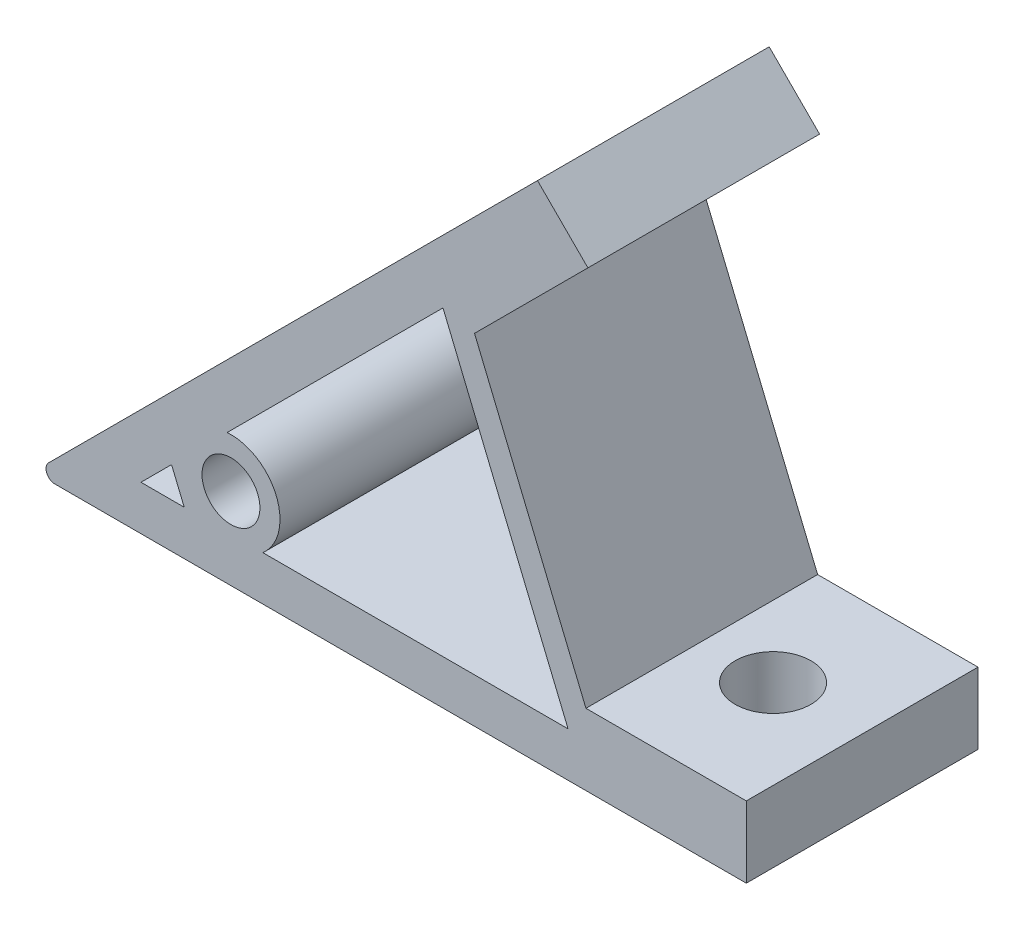
ISO-10303-21;
HEADER;
FILE_DESCRIPTION(('STEP AP214'),'2;1');
FILE_NAME('part.step','',(''),(''),'','','');
FILE_SCHEMA(('AUTOMOTIVE_DESIGN { 1 0 10303 214 1 1 1 1 }'));
ENDSEC;
DATA;
#1=APPLICATION_CONTEXT('core data for automotive mechanical design processes');
#2=APPLICATION_PROTOCOL_DEFINITION('international standard','automotive_design',2000,#1);
#3=PRODUCT_CONTEXT('',#1,'mechanical');
#4=PRODUCT('Part','Part','',(#3));
#5=PRODUCT_RELATED_PRODUCT_CATEGORY('part','',(#4));
#6=PRODUCT_DEFINITION_FORMATION('','',#4);
#7=PRODUCT_DEFINITION_CONTEXT('part definition',#1,'design');
#8=PRODUCT_DEFINITION('design','',#6,#7);
#9=PRODUCT_DEFINITION_SHAPE('','',#8);
#10=(LENGTH_UNIT() NAMED_UNIT(*) SI_UNIT(.MILLI.,.METRE.));
#11=(NAMED_UNIT(*) PLANE_ANGLE_UNIT() SI_UNIT($,.RADIAN.));
#12=(NAMED_UNIT(*) SI_UNIT($,.STERADIAN.) SOLID_ANGLE_UNIT());
#13=UNCERTAINTY_MEASURE_WITH_UNIT(LENGTH_MEASURE(1.E-05),#10,'distance_accuracy_value','');
#14=(GEOMETRIC_REPRESENTATION_CONTEXT(3) GLOBAL_UNCERTAINTY_ASSIGNED_CONTEXT((#13)) GLOBAL_UNIT_ASSIGNED_CONTEXT((#10,
#11,#12)) REPRESENTATION_CONTEXT('',''));
#15=CARTESIAN_POINT('',(0.,0.,0.));
#16=DIRECTION('',(0.,0.,1.));
#17=DIRECTION('',(1.,0.,0.));
#18=AXIS2_PLACEMENT_3D('',#15,#16,#17);
#19=CARTESIAN_POINT('',(-30.4993179415646,38.1869735594505,13.));
#20=DIRECTION('',(-0.707106781186548,0.707106781186547,0.));
#21=DIRECTION('',(-0.707106781186547,-0.707106781186548,0.));
#22=AXIS2_PLACEMENT_3D('',#19,#20,#21);
#23=PLANE('',#22);
#24=DIRECTION('',(0.707106781186547,0.707106781186548,0.));
#25=VECTOR('',#24,1.);
#26=CARTESIAN_POINT('',(-30.4993179415646,38.1869735594505,-13.));
#27=LINE('',#26,#25);
#28=CARTESIAN_POINT('',(-30.4993179415646,38.1869735594505,-13.));
#29=VERTEX_POINT('',#28);
#30=CARTESIAN_POINT('',(-17.7746032555838,50.9116882454314,-13.));
#31=VERTEX_POINT('',#30);
#32=EDGE_CURVE('E236',#29,#31,#27,.T.);
#33=ORIENTED_EDGE('',*,*,#32,.T.);
#34=DIRECTION('',(0.,0.,-1.));
#35=VECTOR('',#34,1.);
#36=CARTESIAN_POINT('',(-17.7746032555838,50.9116882454314,13.));
#37=LINE('',#36,#35);
#38=CARTESIAN_POINT('',(-17.7746032555838,50.9116882454314,13.));
#39=VERTEX_POINT('',#38);
#40=EDGE_CURVE('E246',#39,#31,#37,.T.);
#41=ORIENTED_EDGE('',*,*,#40,.F.);
#42=DIRECTION('',(0.707106781186547,0.707106781186548,0.));
#43=VECTOR('',#42,1.);
#44=CARTESIAN_POINT('',(-30.4993179415646,38.1869735594505,13.));
#45=LINE('',#44,#43);
#46=CARTESIAN_POINT('',(-30.4993179415646,38.1869735594505,13.));
#47=VERTEX_POINT('',#46);
#48=EDGE_CURVE('E219',#47,#39,#45,.T.);
#49=ORIENTED_EDGE('',*,*,#48,.F.);
#50=DIRECTION('',(0.,0.,-1.));
#51=VECTOR('',#50,1.);
#52=CARTESIAN_POINT('',(-30.4993179415646,38.1869735594505,13.));
#53=LINE('',#52,#51);
#54=EDGE_CURVE('E249',#47,#29,#53,.T.);
#55=ORIENTED_EDGE('',*,*,#54,.T.);
#56=EDGE_LOOP('',(#33,#41,#49,#55));
#57=FACE_BOUND('',#56,.T.);
#58=CARTESIAN_POINT('',(-24.8456710674492,43.8406204335659,0.));
#59=DIRECTION('',(-0.70710678118655,0.707106781186545,0.));
#60=DIRECTION('',(-0.707106781186546,-0.707106781186549,0.));
#61=AXIS2_PLACEMENT_3D('',#58,#59,#60);
#62=CIRCLE('',#61,4.25);
#63=CARTESIAN_POINT('',(-27.850874887492,40.8354166135231,0.));
#64=VERTEX_POINT('',#63);
#65=EDGE_CURVE('E305',#64,#64,#62,.T.);
#66=ORIENTED_EDGE('',*,*,#65,.T.);
#67=EDGE_LOOP('',(#66));
#68=FACE_BOUND('',#67,.T.);
#69=ADVANCED_FACE('F35',(#57,#68),#23,.F.);
#70=CARTESIAN_POINT('',(-78.2928932188134,1.7071067811866,13.));
#71=DIRECTION('',(0.707106781186548,-0.707106781186547,0.));
#72=DIRECTION('',(0.707106781186547,0.707106781186548,0.));
#73=AXIS2_PLACEMENT_3D('',#70,#71,#72);
#74=PLANE('',#73);
#75=DIRECTION('',(-0.707106781186547,-0.707106781186548,0.));
#76=VECTOR('',#75,1.);
#77=CARTESIAN_POINT('',(-78.2928932188134,1.7071067811866,-13.));
#78=LINE('',#77,#76);
#79=CARTESIAN_POINT('',(-23.4314575050762,56.5685424949238,-13.));
#80=VERTEX_POINT('',#79);
#81=CARTESIAN_POINT('',(-78.2928932188134,1.7071067811866,-13.));
#82=VERTEX_POINT('',#81);
#83=EDGE_CURVE('E211',#80,#82,#78,.T.);
#84=ORIENTED_EDGE('',*,*,#83,.T.);
#85=DIRECTION('',(0.,0.,-1.));
#86=VECTOR('',#85,1.);
#87=CARTESIAN_POINT('',(-78.2928932188134,1.7071067811866,13.));
#88=LINE('',#87,#86);
#89=CARTESIAN_POINT('',(-78.2928932188134,1.7071067811866,13.));
#90=VERTEX_POINT('',#89);
#91=EDGE_CURVE('E225',#90,#82,#88,.T.);
#92=ORIENTED_EDGE('',*,*,#91,.F.);
#93=DIRECTION('',(-0.707106781186547,-0.707106781186548,0.));
#94=VECTOR('',#93,1.);
#95=CARTESIAN_POINT('',(-78.2928932188134,1.7071067811866,13.));
#96=LINE('',#95,#94);
#97=CARTESIAN_POINT('',(-23.4314575050762,56.5685424949238,13.));
#98=VERTEX_POINT('',#97);
#99=EDGE_CURVE('E223',#98,#90,#96,.T.);
#100=ORIENTED_EDGE('',*,*,#99,.F.);
#101=DIRECTION('',(0.,0.,-1.));
#102=VECTOR('',#101,1.);
#103=CARTESIAN_POINT('',(-23.4314575050762,56.5685424949238,13.));
#104=LINE('',#103,#102);
#105=EDGE_CURVE('E243',#98,#80,#104,.T.);
#106=ORIENTED_EDGE('',*,*,#105,.T.);
#107=EDGE_LOOP('',(#84,#92,#100,#106));
#108=FACE_BOUND('',#107,.T.);
#109=CARTESIAN_POINT('',(-30.5025253169417,49.4974746830583,0.));
#110=DIRECTION('',(0.707106781186548,-0.707106781186547,0.));
#111=DIRECTION('',(0.707106781186547,0.707106781186548,0.));
#112=AXIS2_PLACEMENT_3D('',#109,#110,#111);
#113=CIRCLE('',#112,4.25);
#114=CARTESIAN_POINT('',(-27.4973214968988,52.5026785031012,0.));
#115=VERTEX_POINT('',#114);
#116=EDGE_CURVE('E39',#115,#115,#113,.F.);
#117=ORIENTED_EDGE('',*,*,#116,.F.);
#118=EDGE_LOOP('',(#117));
#119=FACE_BOUND('',#118,.T.);
#120=ADVANCED_FACE('F292',(#108,#119),#74,.F.);
#121=CARTESIAN_POINT('',(-77.5857864376269,1.,13.));
#122=DIRECTION('',(0.,0.,1.));
#123=DIRECTION('',(1.,0.,0.));
#124=AXIS2_PLACEMENT_3D('',#121,#122,#123);
#125=PLANE('',#124);
#126=DIRECTION('',(1.,0.,0.));
#127=VECTOR('',#126,1.);
#128=CARTESIAN_POINT('',(-54.2574687525298,5.,13.));
#129=LINE('',#128,#127);
#130=CARTESIAN_POINT('',(-54.2574687525298,5.,13.));
#131=VERTEX_POINT('',#130);
#132=CARTESIAN_POINT('',(-20.,5.,13.));
#133=VERTEX_POINT('',#132);
#134=EDGE_CURVE('E151',#131,#133,#129,.T.);
#135=ORIENTED_EDGE('',*,*,#134,.F.);
#136=CARTESIAN_POINT('',(-57.8268912197291,9.18440237676214,13.));
#137=DIRECTION('',(0.,0.,-1.));
#138=DIRECTION('',(1.,0.,0.));
#139=AXIS2_PLACEMENT_3D('',#136,#137,#138);
#140=CIRCLE('',#139,5.49999999999996);
#141=CARTESIAN_POINT('',(-58.2617476840749,14.6671845040599,13.));
#142=VERTEX_POINT('',#141);
#143=EDGE_CURVE('E143',#142,#131,#140,.T.);
#144=ORIENTED_EDGE('',*,*,#143,.F.);
#145=DIRECTION('',(-0.707106781186549,-0.707106781186546,0.));
#146=VECTOR('',#145,1.);
#147=CARTESIAN_POINT('',(-58.2617476840749,14.6671845040599,13.));
#148=LINE('',#147,#146);
#149=CARTESIAN_POINT('',(-34.0380592228744,38.8908729652603,13.));
#150=VERTEX_POINT('',#149);
#151=EDGE_CURVE('E167',#150,#142,#148,.T.);
#152=ORIENTED_EDGE('',*,*,#151,.F.);
#153=DIRECTION('',(-0.382683432365087,0.923879532511288,0.));
#154=VECTOR('',#153,1.);
#155=CARTESIAN_POINT('',(-20.,5.,13.));
#156=LINE('',#155,#154);
#157=EDGE_CURVE('E165',#133,#150,#156,.T.);
#158=ORIENTED_EDGE('',*,*,#157,.F.);
#159=EDGE_LOOP('',(#135,#144,#152,#158));
#160=FACE_BOUND('',#159,.T.);
#161=CARTESIAN_POINT('',(-77.5857864376269,1.,13.));
#162=DIRECTION('',(0.,0.,1.));
#163=DIRECTION('',(1.,0.,0.));
#164=AXIS2_PLACEMENT_3D('',#161,#162,#163);
#165=CIRCLE('',#164,1.);
#166=CARTESIAN_POINT('',(-77.5857864376269,0.,13.));
#167=VERTEX_POINT('',#166);
#168=EDGE_CURVE('E207',#90,#167,#165,.T.);
#169=ORIENTED_EDGE('',*,*,#168,.T.);
#170=DIRECTION('',(1.,0.,0.));
#171=VECTOR('',#170,1.);
#172=CARTESIAN_POINT('',(-77.5857864376269,0.,13.));
#173=LINE('',#172,#171);
#174=CARTESIAN_POINT('',(0.,0.,13.));
#175=VERTEX_POINT('',#174);
#176=EDGE_CURVE('E210',#167,#175,#173,.T.);
#177=ORIENTED_EDGE('',*,*,#176,.T.);
#178=DIRECTION('',(0.,1.,0.));
#179=VECTOR('',#178,1.);
#180=CARTESIAN_POINT('',(0.,0.,13.));
#181=LINE('',#180,#179);
#182=CARTESIAN_POINT('',(0.,8.,13.));
#183=VERTEX_POINT('',#182);
#184=EDGE_CURVE('E213',#175,#183,#181,.T.);
#185=ORIENTED_EDGE('',*,*,#184,.T.);
#186=DIRECTION('',(-1.,0.,0.));
#187=VECTOR('',#186,1.);
#188=CARTESIAN_POINT('',(-17.995464086242,8.00000000000012,13.));
#189=LINE('',#188,#187);
#190=CARTESIAN_POINT('',(-17.995464086242,8.00000000000012,13.));
#191=VERTEX_POINT('',#190);
#192=EDGE_CURVE('E215',#183,#191,#189,.T.);
#193=ORIENTED_EDGE('',*,*,#192,.T.);
#194=DIRECTION('',(-0.382683432365096,0.923879532511284,0.));
#195=VECTOR('',#194,1.);
#196=CARTESIAN_POINT('',(-17.995464086242,8.00000000000012,13.));
#197=LINE('',#196,#195);
#198=EDGE_CURVE('E217',#191,#47,#197,.T.);
#199=ORIENTED_EDGE('',*,*,#198,.T.);
#200=ORIENTED_EDGE('',*,*,#48,.T.);
#201=DIRECTION('',(-0.707106781186548,0.707106781186547,0.));
#202=VECTOR('',#201,1.);
#203=CARTESIAN_POINT('',(-17.7746032555838,50.9116882454314,13.));
#204=LINE('',#203,#202);
#205=EDGE_CURVE('E221',#39,#98,#204,.T.);
#206=ORIENTED_EDGE('',*,*,#205,.T.);
#207=ORIENTED_EDGE('',*,*,#99,.T.);
#208=EDGE_LOOP('',(#169,#177,#185,#193,#199,#200,#206,#207));
#209=FACE_BOUND('',#208,.T.);
#210=DIRECTION('',(1.,0.,0.));
#211=VECTOR('',#210,1.);
#212=CARTESIAN_POINT('',(-67.9289321881347,5.,13.));
#213=LINE('',#212,#211);
#214=CARTESIAN_POINT('',(-67.9289321881347,5.,13.));
#215=VERTEX_POINT('',#214);
#216=CARTESIAN_POINT('',(-63.0744704704145,5.00000000000011,13.));
#217=VERTEX_POINT('',#216);
#218=EDGE_CURVE('E185',#215,#217,#213,.T.);
#219=ORIENTED_EDGE('',*,*,#218,.F.);
#220=DIRECTION('',(-0.70710678118656,-0.707106781186535,0.));
#221=VECTOR('',#220,1.);
#222=CARTESIAN_POINT('',(-67.9289321881347,5.,13.));
#223=LINE('',#222,#221);
#224=CARTESIAN_POINT('',(-64.4963093885244,8.43262279961016,13.));
#225=VERTEX_POINT('',#224);
#226=EDGE_CURVE('E183',#225,#215,#223,.T.);
#227=ORIENTED_EDGE('',*,*,#226,.F.);
#228=DIRECTION('',(-0.382683432365157,0.923879532511259,0.));
#229=VECTOR('',#228,1.);
#230=CARTESIAN_POINT('',(-63.0744704704145,5.00000000000011,13.));
#231=LINE('',#230,#229);
#232=EDGE_CURVE('E189',#217,#225,#231,.T.);
#233=ORIENTED_EDGE('',*,*,#232,.F.);
#234=EDGE_LOOP('',(#219,#227,#233));
#235=FACE_BOUND('',#234,.T.);
#236=CARTESIAN_POINT('',(-57.8268912197291,9.18440237676214,13.));
#237=DIRECTION('',(0.,0.,1.));
#238=DIRECTION('',(1.,0.,0.));
#239=AXIS2_PLACEMENT_3D('',#236,#237,#238);
#240=CIRCLE('',#239,3.25);
#241=CARTESIAN_POINT('',(-61.0768912197291,9.18440237676214,13.));
#242=VERTEX_POINT('',#241);
#243=EDGE_CURVE('E173',#242,#242,#240,.T.);
#244=ORIENTED_EDGE('',*,*,#243,.F.);
#245=EDGE_LOOP('',(#244));
#246=FACE_BOUND('',#245,.T.);
#247=ADVANCED_FACE('F163',(#160,#209,#235,#246),#125,.T.);
#248=CARTESIAN_POINT('',(-77.5857864376269,1.,-13.));
#249=DIRECTION('',(0.,0.,1.));
#250=DIRECTION('',(1.,0.,0.));
#251=AXIS2_PLACEMENT_3D('',#248,#249,#250);
#252=PLANE('',#251);
#253=CARTESIAN_POINT('',(-57.8268912197291,9.18440237676214,-13.));
#254=DIRECTION('',(0.,0.,-1.));
#255=DIRECTION('',(1.,0.,0.));
#256=AXIS2_PLACEMENT_3D('',#253,#254,#255);
#257=CIRCLE('',#256,5.49999999999996);
#258=CARTESIAN_POINT('',(-58.2617476840749,14.6671845040599,-13.));
#259=VERTEX_POINT('',#258);
#260=CARTESIAN_POINT('',(-54.2574687525298,5.,-13.));
#261=VERTEX_POINT('',#260);
#262=EDGE_CURVE('E59',#259,#261,#257,.T.);
#263=ORIENTED_EDGE('',*,*,#262,.T.);
#264=DIRECTION('',(1.,0.,0.));
#265=VECTOR('',#264,1.);
#266=CARTESIAN_POINT('',(-54.2574687525298,5.,-13.));
#267=LINE('',#266,#265);
#268=CARTESIAN_POINT('',(-20.,5.,-13.));
#269=VERTEX_POINT('',#268);
#270=EDGE_CURVE('E158',#261,#269,#267,.T.);
#271=ORIENTED_EDGE('',*,*,#270,.T.);
#272=DIRECTION('',(-0.382683432365087,0.923879532511288,0.));
#273=VECTOR('',#272,1.);
#274=CARTESIAN_POINT('',(-20.,5.,-13.));
#275=LINE('',#274,#273);
#276=CARTESIAN_POINT('',(-34.0380592228744,38.8908729652603,-13.));
#277=VERTEX_POINT('',#276);
#278=EDGE_CURVE('E175',#269,#277,#275,.T.);
#279=ORIENTED_EDGE('',*,*,#278,.T.);
#280=DIRECTION('',(-0.707106781186549,-0.707106781186546,0.));
#281=VECTOR('',#280,1.);
#282=CARTESIAN_POINT('',(-58.2617476840749,14.6671845040599,-13.));
#283=LINE('',#282,#281);
#284=EDGE_CURVE('E152',#277,#259,#283,.T.);
#285=ORIENTED_EDGE('',*,*,#284,.T.);
#286=EDGE_LOOP('',(#263,#271,#279,#285));
#287=FACE_BOUND('',#286,.T.);
#288=CARTESIAN_POINT('',(-77.5857864376269,1.,-13.));
#289=DIRECTION('',(0.,0.,1.));
#290=DIRECTION('',(1.,0.,0.));
#291=AXIS2_PLACEMENT_3D('',#288,#289,#290);
#292=CIRCLE('',#291,1.);
#293=CARTESIAN_POINT('',(-77.5857864376269,0.,-13.));
#294=VERTEX_POINT('',#293);
#295=EDGE_CURVE('E206',#82,#294,#292,.T.);
#296=ORIENTED_EDGE('',*,*,#295,.F.);
#297=ORIENTED_EDGE('',*,*,#83,.F.);
#298=DIRECTION('',(-0.707106781186548,0.707106781186547,0.));
#299=VECTOR('',#298,1.);
#300=CARTESIAN_POINT('',(-17.7746032555838,50.9116882454314,-13.));
#301=LINE('',#300,#299);
#302=EDGE_CURVE('E238',#31,#80,#301,.T.);
#303=ORIENTED_EDGE('',*,*,#302,.F.);
#304=ORIENTED_EDGE('',*,*,#32,.F.);
#305=DIRECTION('',(-0.382683432365096,0.923879532511284,0.));
#306=VECTOR('',#305,1.);
#307=CARTESIAN_POINT('',(-17.995464086242,8.00000000000012,-13.));
#308=LINE('',#307,#306);
#309=CARTESIAN_POINT('',(-17.995464086242,8.00000000000012,-13.));
#310=VERTEX_POINT('',#309);
#311=EDGE_CURVE('E234',#310,#29,#308,.T.);
#312=ORIENTED_EDGE('',*,*,#311,.F.);
#313=DIRECTION('',(-1.,0.,0.));
#314=VECTOR('',#313,1.);
#315=CARTESIAN_POINT('',(-17.995464086242,8.00000000000012,-13.));
#316=LINE('',#315,#314);
#317=CARTESIAN_POINT('',(0.,8.,-13.));
#318=VERTEX_POINT('',#317);
#319=EDGE_CURVE('E232',#318,#310,#316,.T.);
#320=ORIENTED_EDGE('',*,*,#319,.F.);
#321=DIRECTION('',(0.,1.,0.));
#322=VECTOR('',#321,1.);
#323=CARTESIAN_POINT('',(0.,0.,-13.));
#324=LINE('',#323,#322);
#325=CARTESIAN_POINT('',(0.,0.,-13.));
#326=VERTEX_POINT('',#325);
#327=EDGE_CURVE('E230',#326,#318,#324,.T.);
#328=ORIENTED_EDGE('',*,*,#327,.F.);
#329=DIRECTION('',(1.,0.,0.));
#330=VECTOR('',#329,1.);
#331=CARTESIAN_POINT('',(-77.5857864376269,0.,-13.));
#332=LINE('',#331,#330);
#333=EDGE_CURVE('E228',#294,#326,#332,.T.);
#334=ORIENTED_EDGE('',*,*,#333,.F.);
#335=EDGE_LOOP('',(#296,#297,#303,#304,#312,#320,#328,#334));
#336=FACE_BOUND('',#335,.T.);
#337=DIRECTION('',(-0.70710678118656,-0.707106781186535,0.));
#338=VECTOR('',#337,1.);
#339=CARTESIAN_POINT('',(-67.9289321881347,5.,-13.));
#340=LINE('',#339,#338);
#341=CARTESIAN_POINT('',(-64.4963093885244,8.43262279961016,-13.));
#342=VERTEX_POINT('',#341);
#343=CARTESIAN_POINT('',(-67.9289321881347,5.,-13.));
#344=VERTEX_POINT('',#343);
#345=EDGE_CURVE('E159',#342,#344,#340,.T.);
#346=ORIENTED_EDGE('',*,*,#345,.T.);
#347=DIRECTION('',(1.,0.,0.));
#348=VECTOR('',#347,1.);
#349=CARTESIAN_POINT('',(-67.9289321881347,5.,-13.));
#350=LINE('',#349,#348);
#351=CARTESIAN_POINT('',(-63.0744704704145,5.00000000000011,-13.));
#352=VERTEX_POINT('',#351);
#353=EDGE_CURVE('E194',#344,#352,#350,.T.);
#354=ORIENTED_EDGE('',*,*,#353,.T.);
#355=DIRECTION('',(-0.382683432365157,0.923879532511259,0.));
#356=VECTOR('',#355,1.);
#357=CARTESIAN_POINT('',(-63.0744704704145,5.00000000000011,-13.));
#358=LINE('',#357,#356);
#359=EDGE_CURVE('E186',#352,#342,#358,.T.);
#360=ORIENTED_EDGE('',*,*,#359,.T.);
#361=EDGE_LOOP('',(#346,#354,#360));
#362=FACE_BOUND('',#361,.T.);
#363=CARTESIAN_POINT('',(-57.8268912197291,9.18440237676214,-13.));
#364=DIRECTION('',(0.,0.,1.));
#365=DIRECTION('',(1.,0.,0.));
#366=AXIS2_PLACEMENT_3D('',#363,#364,#365);
#367=CIRCLE('',#366,3.25);
#368=CARTESIAN_POINT('',(-61.0768912197291,9.18440237676214,-13.));
#369=VERTEX_POINT('',#368);
#370=EDGE_CURVE('E316',#369,#369,#367,.T.);
#371=ORIENTED_EDGE('',*,*,#370,.T.);
#372=EDGE_LOOP('',(#371));
#373=FACE_BOUND('',#372,.T.);
#374=ADVANCED_FACE('F269',(#287,#336,#362,#373),#252,.F.);
#375=CARTESIAN_POINT('',(-77.5857864376269,1.,13.));
#376=DIRECTION('',(0.,0.,-1.));
#377=DIRECTION('',(-1.,0.,0.));
#378=AXIS2_PLACEMENT_3D('',#375,#376,#377);
#379=CYLINDRICAL_SURFACE('',#378,1.);
#380=ORIENTED_EDGE('',*,*,#295,.T.);
#381=DIRECTION('',(0.,0.,-1.));
#382=VECTOR('',#381,1.);
#383=CARTESIAN_POINT('',(-77.5857864376269,0.,13.));
#384=LINE('',#383,#382);
#385=EDGE_CURVE('E11',#167,#294,#384,.T.);
#386=ORIENTED_EDGE('',*,*,#385,.F.);
#387=ORIENTED_EDGE('',*,*,#168,.F.);
#388=ORIENTED_EDGE('',*,*,#91,.T.);
#389=EDGE_LOOP('',(#380,#386,#387,#388));
#390=FACE_BOUND('',#389,.T.);
#391=ADVANCED_FACE('F37',(#390),#379,.T.);
#392=CARTESIAN_POINT('',(-77.5857864376269,0.,13.));
#393=DIRECTION('',(0.,1.,0.));
#394=DIRECTION('',(0.,0.,1.));
#395=AXIS2_PLACEMENT_3D('',#392,#393,#394);
#396=PLANE('',#395);
#397=CARTESIAN_POINT('',(-10.,0.,0.));
#398=DIRECTION('',(0.,1.,0.));
#399=DIRECTION('',(0.,0.,1.));
#400=AXIS2_PLACEMENT_3D('',#397,#398,#399);
#401=CIRCLE('',#400,4.25);
#402=CARTESIAN_POINT('',(-10.,0.,4.25));
#403=VERTEX_POINT('',#402);
#404=EDGE_CURVE('E313',#403,#403,#401,.T.);
#405=ORIENTED_EDGE('',*,*,#404,.T.);
#406=EDGE_LOOP('',(#405));
#407=FACE_BOUND('',#406,.T.);
#408=ORIENTED_EDGE('',*,*,#333,.T.);
#409=DIRECTION('',(0.,0.,-1.));
#410=VECTOR('',#409,1.);
#411=CARTESIAN_POINT('',(0.,0.,13.));
#412=LINE('',#411,#410);
#413=EDGE_CURVE('E44',#175,#326,#412,.T.);
#414=ORIENTED_EDGE('',*,*,#413,.F.);
#415=ORIENTED_EDGE('',*,*,#176,.F.);
#416=ORIENTED_EDGE('',*,*,#385,.T.);
#417=EDGE_LOOP('',(#408,#414,#415,#416));
#418=FACE_BOUND('',#417,.T.);
#419=ADVANCED_FACE('F286',(#407,#418),#396,.F.);
#420=CARTESIAN_POINT('',(0.,0.,13.));
#421=DIRECTION('',(-1.,0.,0.));
#422=DIRECTION('',(0.,0.,1.));
#423=AXIS2_PLACEMENT_3D('',#420,#421,#422);
#424=PLANE('',#423);
#425=ORIENTED_EDGE('',*,*,#327,.T.);
#426=DIRECTION('',(0.,0.,-1.));
#427=VECTOR('',#426,1.);
#428=CARTESIAN_POINT('',(0.,8.,13.));
#429=LINE('',#428,#427);
#430=EDGE_CURVE('E255',#183,#318,#429,.T.);
#431=ORIENTED_EDGE('',*,*,#430,.F.);
#432=ORIENTED_EDGE('',*,*,#184,.F.);
#433=ORIENTED_EDGE('',*,*,#413,.T.);
#434=EDGE_LOOP('',(#425,#431,#432,#433));
#435=FACE_BOUND('',#434,.T.);
#436=ADVANCED_FACE('F263',(#435),#424,.F.);
#437=CARTESIAN_POINT('',(-17.995464086242,8.00000000000012,13.));
#438=DIRECTION('',(0.,-1.,0.));
#439=DIRECTION('',(1.,0.,0.));
#440=AXIS2_PLACEMENT_3D('',#437,#438,#439);
#441=PLANE('',#440);
#442=CARTESIAN_POINT('',(-10.,8.00000000000006,0.));
#443=DIRECTION('',(0.,1.,0.));
#444=DIRECTION('',(-1.,0.,0.));
#445=AXIS2_PLACEMENT_3D('',#442,#443,#444);
#446=CIRCLE('',#445,4.25);
#447=CARTESIAN_POINT('',(-14.25,8.00000000000009,0.));
#448=VERTEX_POINT('',#447);
#449=EDGE_CURVE('E309',#448,#448,#446,.T.);
#450=ORIENTED_EDGE('',*,*,#449,.F.);
#451=EDGE_LOOP('',(#450));
#452=FACE_BOUND('',#451,.T.);
#453=ORIENTED_EDGE('',*,*,#319,.T.);
#454=DIRECTION('',(0.,0.,-1.));
#455=VECTOR('',#454,1.);
#456=CARTESIAN_POINT('',(-17.995464086242,8.00000000000012,13.));
#457=LINE('',#456,#455);
#458=EDGE_CURVE('E252',#191,#310,#457,.T.);
#459=ORIENTED_EDGE('',*,*,#458,.F.);
#460=ORIENTED_EDGE('',*,*,#192,.F.);
#461=ORIENTED_EDGE('',*,*,#430,.T.);
#462=EDGE_LOOP('',(#453,#459,#460,#461));
#463=FACE_BOUND('',#462,.T.);
#464=ADVANCED_FACE('F275',(#452,#463),#441,.F.);
#465=CARTESIAN_POINT('',(-17.995464086242,8.00000000000012,13.));
#466=DIRECTION('',(-0.923879532511284,-0.382683432365096,0.));
#467=DIRECTION('',(0.382683432365096,-0.923879532511284,0.));
#468=AXIS2_PLACEMENT_3D('',#465,#466,#467);
#469=PLANE('',#468);
#470=ORIENTED_EDGE('',*,*,#311,.T.);
#471=ORIENTED_EDGE('',*,*,#54,.F.);
#472=ORIENTED_EDGE('',*,*,#198,.F.);
#473=ORIENTED_EDGE('',*,*,#458,.T.);
#474=EDGE_LOOP('',(#470,#471,#472,#473));
#475=FACE_BOUND('',#474,.T.);
#476=ADVANCED_FACE('F279',(#475),#469,.F.);
#477=CARTESIAN_POINT('',(-17.7746032555838,50.9116882454314,13.));
#478=DIRECTION('',(-0.707106781186547,-0.707106781186548,0.));
#479=DIRECTION('',(0.707106781186548,-0.707106781186547,0.));
#480=AXIS2_PLACEMENT_3D('',#477,#478,#479);
#481=PLANE('',#480);
#482=ORIENTED_EDGE('',*,*,#302,.T.);
#483=ORIENTED_EDGE('',*,*,#105,.F.);
#484=ORIENTED_EDGE('',*,*,#205,.F.);
#485=ORIENTED_EDGE('',*,*,#40,.T.);
#486=EDGE_LOOP('',(#482,#483,#484,#485));
#487=FACE_BOUND('',#486,.T.);
#488=ADVANCED_FACE('F298',(#487),#481,.F.);
#489=CARTESIAN_POINT('',(-67.9289321881347,5.,13.));
#490=DIRECTION('',(0.707106781186535,-0.70710678118656,0.));
#491=DIRECTION('',(0.70710678118656,0.707106781186535,0.));
#492=AXIS2_PLACEMENT_3D('',#489,#490,#491);
#493=PLANE('',#492);
#494=ORIENTED_EDGE('',*,*,#345,.F.);
#495=DIRECTION('',(0.,0.,-1.));
#496=VECTOR('',#495,1.);
#497=CARTESIAN_POINT('',(-64.4963093885244,8.43262279961016,13.));
#498=LINE('',#497,#496);
#499=EDGE_CURVE('E191',#225,#342,#498,.T.);
#500=ORIENTED_EDGE('',*,*,#499,.F.);
#501=ORIENTED_EDGE('',*,*,#226,.T.);
#502=DIRECTION('',(0.,0.,-1.));
#503=VECTOR('',#502,1.);
#504=CARTESIAN_POINT('',(-67.9289321881347,5.,13.));
#505=LINE('',#504,#503);
#506=EDGE_CURVE('E203',#215,#344,#505,.T.);
#507=ORIENTED_EDGE('',*,*,#506,.T.);
#508=EDGE_LOOP('',(#494,#500,#501,#507));
#509=FACE_BOUND('',#508,.T.);
#510=ADVANCED_FACE('F353',(#509),#493,.T.);
#511=CARTESIAN_POINT('',(-67.9289321881347,5.,13.));
#512=DIRECTION('',(0.,1.,0.));
#513=DIRECTION('',(-1.,0.,0.));
#514=AXIS2_PLACEMENT_3D('',#511,#512,#513);
#515=PLANE('',#514);
#516=ORIENTED_EDGE('',*,*,#353,.F.);
#517=ORIENTED_EDGE('',*,*,#506,.F.);
#518=ORIENTED_EDGE('',*,*,#218,.T.);
#519=DIRECTION('',(0.,0.,-1.));
#520=VECTOR('',#519,1.);
#521=CARTESIAN_POINT('',(-63.0744704704145,5.00000000000011,13.));
#522=LINE('',#521,#520);
#523=EDGE_CURVE('E201',#217,#352,#522,.T.);
#524=ORIENTED_EDGE('',*,*,#523,.T.);
#525=EDGE_LOOP('',(#516,#517,#518,#524));
#526=FACE_BOUND('',#525,.T.);
#527=ADVANCED_FACE('F349',(#526),#515,.T.);
#528=CARTESIAN_POINT('',(-63.0744704704145,5.00000000000011,13.));
#529=DIRECTION('',(-0.923879532511259,-0.382683432365157,0.));
#530=DIRECTION('',(0.382683432365157,-0.923879532511259,0.));
#531=AXIS2_PLACEMENT_3D('',#528,#529,#530);
#532=PLANE('',#531);
#533=ORIENTED_EDGE('',*,*,#359,.F.);
#534=ORIENTED_EDGE('',*,*,#523,.F.);
#535=ORIENTED_EDGE('',*,*,#232,.T.);
#536=ORIENTED_EDGE('',*,*,#499,.T.);
#537=EDGE_LOOP('',(#533,#534,#535,#536));
#538=FACE_BOUND('',#537,.T.);
#539=ADVANCED_FACE('F346',(#538),#532,.T.);
#540=CARTESIAN_POINT('',(-57.8268912197291,9.18440237676214,13.));
#541=DIRECTION('',(0.,0.,-1.));
#542=DIRECTION('',(-1.,0.,0.));
#543=AXIS2_PLACEMENT_3D('',#540,#541,#542);
#544=CYLINDRICAL_SURFACE('',#543,5.49999999999996);
#545=ORIENTED_EDGE('',*,*,#262,.F.);
#546=DIRECTION('',(0.,0.,-1.));
#547=VECTOR('',#546,1.);
#548=CARTESIAN_POINT('',(-58.2617476840749,14.6671845040599,13.));
#549=LINE('',#548,#547);
#550=EDGE_CURVE('E147',#142,#259,#549,.T.);
#551=ORIENTED_EDGE('',*,*,#550,.F.);
#552=ORIENTED_EDGE('',*,*,#143,.T.);
#553=DIRECTION('',(0.,0.,-1.));
#554=VECTOR('',#553,1.);
#555=CARTESIAN_POINT('',(-54.2574687525298,5.,13.));
#556=LINE('',#555,#554);
#557=EDGE_CURVE('E146',#131,#261,#556,.T.);
#558=ORIENTED_EDGE('',*,*,#557,.T.);
#559=EDGE_LOOP('',(#545,#551,#552,#558));
#560=FACE_BOUND('',#559,.T.);
#561=ADVANCED_FACE('F145',(#560),#544,.T.);
#562=CARTESIAN_POINT('',(-54.2574687525298,5.,13.));
#563=DIRECTION('',(0.,1.,0.));
#564=DIRECTION('',(0.,0.,1.));
#565=AXIS2_PLACEMENT_3D('',#562,#563,#564);
#566=PLANE('',#565);
#567=ORIENTED_EDGE('',*,*,#270,.F.);
#568=ORIENTED_EDGE('',*,*,#557,.F.);
#569=ORIENTED_EDGE('',*,*,#134,.T.);
#570=DIRECTION('',(0.,0.,-1.));
#571=VECTOR('',#570,1.);
#572=CARTESIAN_POINT('',(-20.,5.,13.));
#573=LINE('',#572,#571);
#574=EDGE_CURVE('E160',#133,#269,#573,.T.);
#575=ORIENTED_EDGE('',*,*,#574,.T.);
#576=EDGE_LOOP('',(#567,#568,#569,#575));
#577=FACE_BOUND('',#576,.T.);
#578=ADVANCED_FACE('F155',(#577),#566,.T.);
#579=CARTESIAN_POINT('',(-20.,5.,13.));
#580=DIRECTION('',(-0.923879532511288,-0.382683432365087,0.));
#581=DIRECTION('',(0.382683432365087,-0.923879532511288,0.));
#582=AXIS2_PLACEMENT_3D('',#579,#580,#581);
#583=PLANE('',#582);
#584=ORIENTED_EDGE('',*,*,#278,.F.);
#585=ORIENTED_EDGE('',*,*,#574,.F.);
#586=ORIENTED_EDGE('',*,*,#157,.T.);
#587=DIRECTION('',(0.,0.,-1.));
#588=VECTOR('',#587,1.);
#589=CARTESIAN_POINT('',(-34.0380592228744,38.8908729652603,13.));
#590=LINE('',#589,#588);
#591=EDGE_CURVE('E51',#150,#277,#590,.T.);
#592=ORIENTED_EDGE('',*,*,#591,.T.);
#593=EDGE_LOOP('',(#584,#585,#586,#592));
#594=FACE_BOUND('',#593,.T.);
#595=ADVANCED_FACE('F335',(#594),#583,.T.);
#596=CARTESIAN_POINT('',(-58.2617476840749,14.6671845040599,13.));
#597=DIRECTION('',(0.707106781186546,-0.707106781186549,0.));
#598=DIRECTION('',(0.707106781186549,0.707106781186546,0.));
#599=AXIS2_PLACEMENT_3D('',#596,#597,#598);
#600=PLANE('',#599);
#601=ORIENTED_EDGE('',*,*,#284,.F.);
#602=ORIENTED_EDGE('',*,*,#591,.F.);
#603=ORIENTED_EDGE('',*,*,#151,.T.);
#604=ORIENTED_EDGE('',*,*,#550,.T.);
#605=EDGE_LOOP('',(#601,#602,#603,#604));
#606=FACE_BOUND('',#605,.T.);
#607=ADVANCED_FACE('F325',(#606),#600,.T.);
#608=CARTESIAN_POINT('',(-57.8268912197291,9.18440237676214,13.));
#609=DIRECTION('',(0.,0.,-1.));
#610=DIRECTION('',(-1.,0.,0.));
#611=AXIS2_PLACEMENT_3D('',#608,#609,#610);
#612=CYLINDRICAL_SURFACE('',#611,3.25);
#613=CARTESIAN_POINT('',(-61.0768912197291,9.18440237676214,13.));
#614=CARTESIAN_POINT('',(-61.0768912197291,9.18440237676214,12.7291666666667));
#615=CARTESIAN_POINT('',(-61.0768912197291,9.18440237676214,12.4583333333333));
#616=CARTESIAN_POINT('',(-61.0768912197291,9.18440237676214,11.9166666666667));
#617=CARTESIAN_POINT('',(-61.0768912197291,9.18440237676214,11.6458333333333));
#618=CARTESIAN_POINT('',(-61.0768912197291,9.18440237676214,11.1041666666667));
#619=CARTESIAN_POINT('',(-61.0768912197291,9.18440237676214,10.8333333333333));
#620=CARTESIAN_POINT('',(-61.0768912197291,9.18440237676214,10.2916666666667));
#621=CARTESIAN_POINT('',(-61.0768912197291,9.18440237676214,10.0208333333333));
#622=CARTESIAN_POINT('',(-61.0768912197291,9.18440237676214,9.47916666666667));
#623=CARTESIAN_POINT('',(-61.0768912197291,9.18440237676214,9.20833333333333));
#624=CARTESIAN_POINT('',(-61.0768912197291,9.18440237676214,8.66666666666667));
#625=CARTESIAN_POINT('',(-61.0768912197291,9.18440237676214,8.39583333333333));
#626=CARTESIAN_POINT('',(-61.0768912197291,9.18440237676214,7.85416666666667));
#627=CARTESIAN_POINT('',(-61.0768912197291,9.18440237676214,7.58333333333333));
#628=CARTESIAN_POINT('',(-61.0768912197291,9.18440237676214,7.04166666666667));
#629=CARTESIAN_POINT('',(-61.0768912197291,9.18440237676214,6.77083333333333));
#630=CARTESIAN_POINT('',(-61.0768912197291,9.18440237676214,6.22916666666667));
#631=CARTESIAN_POINT('',(-61.0768912197291,9.18440237676214,5.95833333333333));
#632=CARTESIAN_POINT('',(-61.0768912197291,9.18440237676214,5.41666666666667));
#633=CARTESIAN_POINT('',(-61.0768912197291,9.18440237676214,5.14583333333333));
#634=CARTESIAN_POINT('',(-61.0768912197291,9.18440237676214,4.60416666666667));
#635=CARTESIAN_POINT('',(-61.0768912197291,9.18440237676214,4.33333333333333));
#636=CARTESIAN_POINT('',(-61.0768912197291,9.18440237676214,3.79166666666667));
#637=CARTESIAN_POINT('',(-61.0768912197291,9.18440237676214,3.52083333333333));
#638=CARTESIAN_POINT('',(-61.0768912197291,9.18440237676214,2.97916666666666));
#639=CARTESIAN_POINT('',(-61.0768912197291,9.18440237676214,2.70833333333333));
#640=CARTESIAN_POINT('',(-61.0768912197291,9.18440237676214,2.16666666666667));
#641=CARTESIAN_POINT('',(-61.0768912197291,9.18440237676214,1.89583333333333));
#642=CARTESIAN_POINT('',(-61.0768912197291,9.18440237676214,1.35416666666666));
#643=CARTESIAN_POINT('',(-61.0768912197291,9.18440237676214,1.08333333333333));
#644=CARTESIAN_POINT('',(-61.0768912197291,9.18440237676214,0.541666666666665));
#645=CARTESIAN_POINT('',(-61.0768912197291,9.18440237676214,0.270833333333332));
#646=CARTESIAN_POINT('',(-61.0768912197291,9.18440237676214,-0.270833333333335));
#647=CARTESIAN_POINT('',(-61.0768912197291,9.18440237676214,-0.541666666666669));
#648=CARTESIAN_POINT('',(-61.0768912197291,9.18440237676214,-1.08333333333334));
#649=CARTESIAN_POINT('',(-61.0768912197291,9.18440237676214,-1.35416666666667));
#650=CARTESIAN_POINT('',(-61.0768912197291,9.18440237676214,-1.89583333333333));
#651=CARTESIAN_POINT('',(-61.0768912197291,9.18440237676214,-2.16666666666667));
#652=CARTESIAN_POINT('',(-61.0768912197291,9.18440237676214,-2.70833333333333));
#653=CARTESIAN_POINT('',(-61.0768912197291,9.18440237676214,-2.97916666666667));
#654=CARTESIAN_POINT('',(-61.0768912197291,9.18440237676214,-3.52083333333333));
#655=CARTESIAN_POINT('',(-61.0768912197291,9.18440237676214,-3.79166666666667));
#656=CARTESIAN_POINT('',(-61.0768912197291,9.18440237676214,-4.33333333333333));
#657=CARTESIAN_POINT('',(-61.0768912197291,9.18440237676214,-4.60416666666667));
#658=CARTESIAN_POINT('',(-61.0768912197291,9.18440237676214,-5.14583333333333));
#659=CARTESIAN_POINT('',(-61.0768912197291,9.18440237676214,-5.41666666666667));
#660=CARTESIAN_POINT('',(-61.0768912197291,9.18440237676214,-5.95833333333333));
#661=CARTESIAN_POINT('',(-61.0768912197291,9.18440237676214,-6.22916666666667));
#662=CARTESIAN_POINT('',(-61.0768912197291,9.18440237676214,-6.77083333333333));
#663=CARTESIAN_POINT('',(-61.0768912197291,9.18440237676214,-7.04166666666667));
#664=CARTESIAN_POINT('',(-61.0768912197291,9.18440237676214,-7.58333333333333));
#665=CARTESIAN_POINT('',(-61.0768912197291,9.18440237676214,-7.85416666666667));
#666=CARTESIAN_POINT('',(-61.0768912197291,9.18440237676214,-8.39583333333333));
#667=CARTESIAN_POINT('',(-61.0768912197291,9.18440237676214,-8.66666666666667));
#668=CARTESIAN_POINT('',(-61.0768912197291,9.18440237676214,-9.20833333333333));
#669=CARTESIAN_POINT('',(-61.0768912197291,9.18440237676214,-9.47916666666667));
#670=CARTESIAN_POINT('',(-61.0768912197291,9.18440237676214,-10.0208333333333));
#671=CARTESIAN_POINT('',(-61.0768912197291,9.18440237676214,-10.2916666666667));
#672=CARTESIAN_POINT('',(-61.0768912197291,9.18440237676214,-10.8333333333333));
#673=CARTESIAN_POINT('',(-61.0768912197291,9.18440237676214,-11.1041666666667));
#674=CARTESIAN_POINT('',(-61.0768912197291,9.18440237676214,-11.6458333333333));
#675=CARTESIAN_POINT('',(-61.0768912197291,9.18440237676214,-11.9166666666667));
#676=CARTESIAN_POINT('',(-61.0768912197291,9.18440237676214,-12.4583333333333));
#677=CARTESIAN_POINT('',(-61.0768912197291,9.18440237676214,-12.7291666666667));
#678=CARTESIAN_POINT('',(-61.0768912197291,9.18440237676214,-13.));
#679=B_SPLINE_CURVE_WITH_KNOTS('',3,(#613,#614,#615,#616,#617,#618,#619,#620,#621,#622,#623,
#624,#625,#626,#627,#628,#629,#630,#631,#632,#633,#634,#635,#636,#637,#638,#639,#640,#641,#642,
#643,#644,#645,#646,#647,#648,#649,#650,#651,#652,#653,#654,#655,#656,#657,#658,#659,#660,#661,
#662,#663,#664,#665,#666,#667,#668,#669,#670,#671,#672,#673,#674,#675,#676,#677,#678),
.UNSPECIFIED.,.F.,.F.,(4,2,2,2,2,2,2,2,2,2,2,2,2,2,2,2,2,2,2,2,2,2,2,2,2,2,2,2,2,2,2,2,4),(0.,
0.812499999999999,1.625,2.4375,3.25,4.0625,4.875,5.6875,6.5,7.3125,8.125,8.9375,9.75,10.5625,
11.375,12.1875,13.,13.8125,14.625,15.4375,16.25,17.0625,17.875,18.6875,19.5,20.3125,21.125,
21.9375,22.75,23.5625,24.375,25.1875,26.),.UNSPECIFIED.);
#680=EDGE_CURVE('BSEAM322',#242,#369,#679,.T.);
#681=ORIENTED_EDGE('',*,*,#243,.T.);
#682=ORIENTED_EDGE('',*,*,#370,.F.);
#683=ORIENTED_EDGE('',*,*,#680,.T.);
#684=ORIENTED_EDGE('',*,*,#680,.F.);
#685=EDGE_LOOP('',(#681,#683,#682,#684));
#686=FACE_BOUND('',#685,.T.);
#687=ADVANCED_FACE('F322',(#686),#612,.F.);
#688=CARTESIAN_POINT('',(-10.0000000000001,-8.99999999999994,0.));
#689=DIRECTION('',(0.,1.,0.));
#690=DIRECTION('',(-1.,0.,0.));
#691=AXIS2_PLACEMENT_3D('',#688,#689,#690);
#692=CYLINDRICAL_SURFACE('',#691,4.25);
#693=ORIENTED_EDGE('',*,*,#449,.T.);
#694=EDGE_LOOP('',(#693));
#695=FACE_BOUND('',#694,.T.);
#696=ORIENTED_EDGE('',*,*,#404,.F.);
#697=EDGE_LOOP('',(#696));
#698=FACE_BOUND('',#697,.T.);
#699=ADVANCED_FACE('F324',(#695,#698),#692,.F.);
#700=CARTESIAN_POINT('',(-36.8664863476205,55.8614357137372,0.));
#701=DIRECTION('',(0.70710678118655,-0.707106781186545,0.));
#702=DIRECTION('',(0.707106781186545,0.70710678118655,0.));
#703=AXIS2_PLACEMENT_3D('',#700,#701,#702);
#704=CYLINDRICAL_SURFACE('',#703,4.25);
#705=ORIENTED_EDGE('',*,*,#65,.F.);
#706=EDGE_LOOP('',(#705));
#707=FACE_BOUND('',#706,.T.);
#708=ORIENTED_EDGE('',*,*,#116,.T.);
#709=EDGE_LOOP('',(#708));
#710=FACE_BOUND('',#709,.T.);
#711=ADVANCED_FACE('F332',(#707,#710),#704,.F.);
#712=CLOSED_SHELL('',(#69,#120,#247,#374,#391,#419,#436,#464,#476,#488,#510,#527,#539,#561,#578,
#595,#607,#687,#699,#711));
#713=MANIFOLD_SOLID_BREP('B2',#712);
#714=ADVANCED_BREP_SHAPE_REPRESENTATION('',(#18,#713),#14);
#715=SHAPE_DEFINITION_REPRESENTATION(#9,#714);
ENDSEC;
END-ISO-10303-21;
